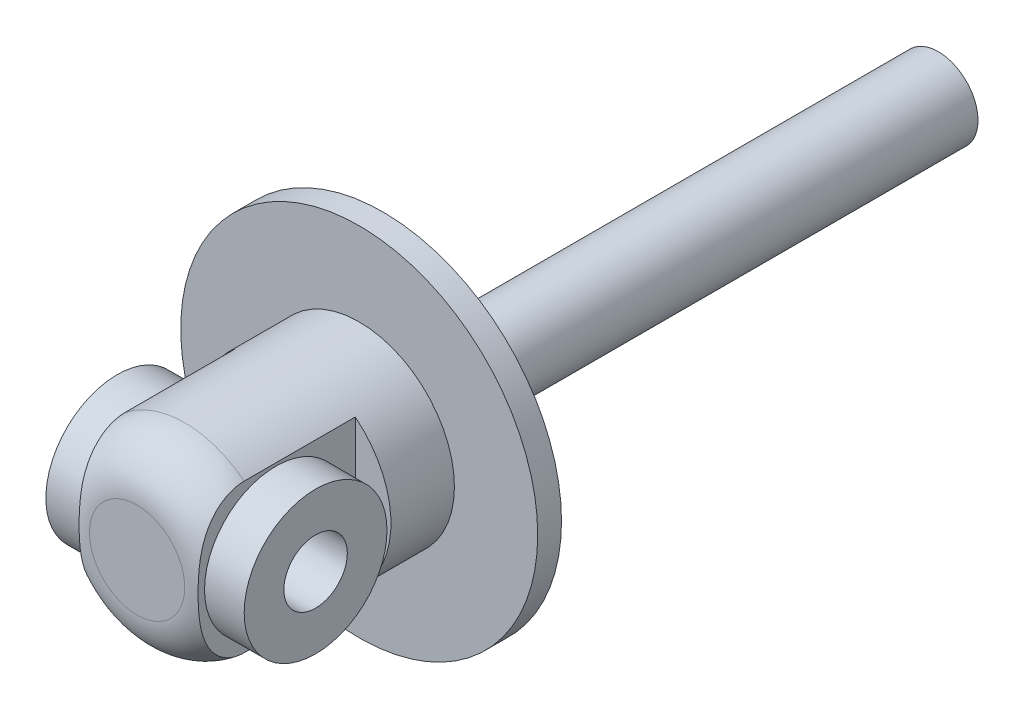
ISO-10303-21;
HEADER;
FILE_DESCRIPTION(('STEP AP214'),'2;1');
FILE_NAME('part.step','',(''),(''),'','','');
FILE_SCHEMA(('AUTOMOTIVE_DESIGN { 1 0 10303 214 1 1 1 1 }'));
ENDSEC;
DATA;
#1=APPLICATION_CONTEXT('core data for automotive mechanical design processes');
#2=APPLICATION_PROTOCOL_DEFINITION('international standard','automotive_design',2000,#1);
#3=PRODUCT_CONTEXT('',#1,'mechanical');
#4=PRODUCT('Part','Part','',(#3));
#5=PRODUCT_RELATED_PRODUCT_CATEGORY('part','',(#4));
#6=PRODUCT_DEFINITION_FORMATION('','',#4);
#7=PRODUCT_DEFINITION_CONTEXT('part definition',#1,'design');
#8=PRODUCT_DEFINITION('design','',#6,#7);
#9=PRODUCT_DEFINITION_SHAPE('','',#8);
#10=(LENGTH_UNIT() NAMED_UNIT(*) SI_UNIT(.MILLI.,.METRE.));
#11=(NAMED_UNIT(*) PLANE_ANGLE_UNIT() SI_UNIT($,.RADIAN.));
#12=(NAMED_UNIT(*) SI_UNIT($,.STERADIAN.) SOLID_ANGLE_UNIT());
#13=UNCERTAINTY_MEASURE_WITH_UNIT(LENGTH_MEASURE(1.E-05),#10,'distance_accuracy_value','');
#14=(GEOMETRIC_REPRESENTATION_CONTEXT(3) GLOBAL_UNCERTAINTY_ASSIGNED_CONTEXT((#13)) GLOBAL_UNIT_ASSIGNED_CONTEXT((#10,
#11,#12)) REPRESENTATION_CONTEXT('',''));
#15=CARTESIAN_POINT('',(0.,0.,0.));
#16=DIRECTION('',(0.,0.,1.));
#17=DIRECTION('',(1.,0.,0.));
#18=AXIS2_PLACEMENT_3D('',#15,#16,#17);
#19=CARTESIAN_POINT('',(0.,0.,70.0000000000001));
#20=DIRECTION('',(0.,0.,-1.));
#21=DIRECTION('',(-1.00000000000001,0.,0.));
#22=AXIS2_PLACEMENT_3D('',#19,#20,#21);
#23=CYLINDRICAL_SURFACE('',#22,5.);
#24=CARTESIAN_POINT('',(0.,0.,70.0000000000001));
#25=DIRECTION('',(0.,0.,1.));
#26=DIRECTION('',(1.00000000000001,0.,0.));
#27=AXIS2_PLACEMENT_3D('',#24,#25,#26);
#28=CIRCLE('',#27,5.);
#29=CARTESIAN_POINT('',(5.00000000000004,0.,70.0000000000001));
#30=VERTEX_POINT('',#29);
#31=EDGE_CURVE('E128',#30,#30,#28,.T.);
#32=ORIENTED_EDGE('',*,*,#31,.F.);
#33=EDGE_LOOP('',(#32));
#34=FACE_BOUND('',#33,.T.);
#35=CARTESIAN_POINT('',(0.,0.,0.));
#36=DIRECTION('',(0.,0.,1.));
#37=DIRECTION('',(1.00000000000001,0.,0.));
#38=AXIS2_PLACEMENT_3D('',#35,#36,#37);
#39=CIRCLE('',#38,5.);
#40=CARTESIAN_POINT('',(5.00000000000004,0.,0.));
#41=VERTEX_POINT('',#40);
#42=EDGE_CURVE('E135',#41,#41,#39,.T.);
#43=ORIENTED_EDGE('',*,*,#42,.T.);
#44=EDGE_LOOP('',(#43));
#45=FACE_BOUND('',#44,.T.);
#46=ADVANCED_FACE('F44',(#34,#45),#23,.T.);
#47=CARTESIAN_POINT('',(0.,0.,0.));
#48=DIRECTION('',(0.,0.,1.));
#49=DIRECTION('',(1.00000000000001,0.,0.));
#50=AXIS2_PLACEMENT_3D('',#47,#48,#49);
#51=PLANE('',#50);
#52=ORIENTED_EDGE('',*,*,#42,.F.);
#53=EDGE_LOOP('',(#52));
#54=FACE_BOUND('',#53,.T.);
#55=ADVANCED_FACE('F187',(#54),#51,.F.);
#56=CARTESIAN_POINT('',(0.,0.,73.));
#57=DIRECTION('',(0.,0.,-1.));
#58=DIRECTION('',(-1.00000000000001,0.,0.));
#59=AXIS2_PLACEMENT_3D('',#56,#57,#58);
#60=CYLINDRICAL_SURFACE('',#59,22.5);
#61=CARTESIAN_POINT('',(0.,0.,73.));
#62=DIRECTION('',(0.,0.,1.));
#63=DIRECTION('',(1.00000000000001,0.,0.));
#64=AXIS2_PLACEMENT_3D('',#61,#62,#63);
#65=CIRCLE('',#64,22.5);
#66=CARTESIAN_POINT('',(22.5000000000002,0.,73.));
#67=VERTEX_POINT('',#66);
#68=EDGE_CURVE('E131',#67,#67,#65,.T.);
#69=ORIENTED_EDGE('',*,*,#68,.F.);
#70=EDGE_LOOP('',(#69));
#71=FACE_BOUND('',#70,.T.);
#72=CARTESIAN_POINT('',(0.,0.,70.0000000000001));
#73=DIRECTION('',(0.,0.,1.));
#74=DIRECTION('',(1.00000000000001,0.,0.));
#75=AXIS2_PLACEMENT_3D('',#72,#73,#74);
#76=CIRCLE('',#75,22.5);
#77=CARTESIAN_POINT('',(22.5000000000002,0.,70.0000000000001));
#78=VERTEX_POINT('',#77);
#79=EDGE_CURVE('E125',#78,#78,#76,.T.);
#80=ORIENTED_EDGE('',*,*,#79,.T.);
#81=EDGE_LOOP('',(#80));
#82=FACE_BOUND('',#81,.T.);
#83=ADVANCED_FACE('F176',(#71,#82),#60,.T.);
#84=CARTESIAN_POINT('',(0.,0.,73.));
#85=DIRECTION('',(0.,0.,1.));
#86=DIRECTION('',(1.00000000000001,0.,0.));
#87=AXIS2_PLACEMENT_3D('',#84,#85,#86);
#88=PLANE('',#87);
#89=CARTESIAN_POINT('',(0.,0.,73.));
#90=DIRECTION('',(0.,0.,1.));
#91=DIRECTION('',(1.00000000000001,0.,0.));
#92=AXIS2_PLACEMENT_3D('',#89,#90,#91);
#93=CIRCLE('',#92,12.);
#94=CARTESIAN_POINT('',(12.0000000000001,0.,73.));
#95=VERTEX_POINT('',#94);
#96=EDGE_CURVE('E121',#95,#95,#93,.T.);
#97=ORIENTED_EDGE('',*,*,#96,.F.);
#98=EDGE_LOOP('',(#97));
#99=FACE_BOUND('',#98,.T.);
#100=ORIENTED_EDGE('',*,*,#68,.T.);
#101=EDGE_LOOP('',(#100));
#102=FACE_BOUND('',#101,.T.);
#103=ADVANCED_FACE('F179',(#99,#102),#88,.T.);
#104=CARTESIAN_POINT('',(0.,0.,70.0000000000001));
#105=DIRECTION('',(0.,0.,1.));
#106=DIRECTION('',(1.00000000000001,0.,0.));
#107=AXIS2_PLACEMENT_3D('',#104,#105,#106);
#108=PLANE('',#107);
#109=ORIENTED_EDGE('',*,*,#31,.T.);
#110=EDGE_LOOP('',(#109));
#111=FACE_BOUND('',#110,.T.);
#112=ORIENTED_EDGE('',*,*,#79,.F.);
#113=EDGE_LOOP('',(#112));
#114=FACE_BOUND('',#113,.T.);
#115=ADVANCED_FACE('F178',(#111,#114),#108,.F.);
#116=CARTESIAN_POINT('',(0.,0.,101.));
#117=DIRECTION('',(0.,0.,-1.));
#118=DIRECTION('',(-1.00000000000001,0.,0.));
#119=AXIS2_PLACEMENT_3D('',#116,#117,#118);
#120=CYLINDRICAL_SURFACE('',#119,12.);
#121=CARTESIAN_POINT('',(0.,0.,95.));
#122=DIRECTION('',(0.,0.,1.));
#123=DIRECTION('',(1.00000000000001,0.,0.));
#124=AXIS2_PLACEMENT_3D('',#121,#122,#123);
#125=CIRCLE('',#124,12.);
#126=CARTESIAN_POINT('',(-7.50000000000006,9.36749699759876,95.));
#127=VERTEX_POINT('',#126);
#128=CARTESIAN_POINT('',(7.50000000000045,9.36749699759853,95.));
#129=VERTEX_POINT('',#128);
#130=EDGE_CURVE('E146',#127,#129,#125,.F.);
#131=ORIENTED_EDGE('',*,*,#130,.T.);
#132=DIRECTION('',(0.,0.,-1.));
#133=VECTOR('',#132,1.);
#134=CARTESIAN_POINT('',(7.50000000000045,9.36749699759853,101.));
#135=LINE('',#134,#133);
#136=CARTESIAN_POINT('',(7.50000000000045,9.36749699759853,81.));
#137=VERTEX_POINT('',#136);
#138=EDGE_CURVE('E64',#129,#137,#135,.T.);
#139=ORIENTED_EDGE('',*,*,#138,.T.);
#140=CARTESIAN_POINT('',(0.,0.,81.));
#141=DIRECTION('',(0.,0.,-1.));
#142=DIRECTION('',(-1.00000000000001,0.,0.));
#143=AXIS2_PLACEMENT_3D('',#140,#141,#142);
#144=CIRCLE('',#143,12.);
#145=CARTESIAN_POINT('',(7.50000000000006,-9.36749699759742,81.));
#146=VERTEX_POINT('',#145);
#147=EDGE_CURVE('E100',#137,#146,#144,.T.);
#148=ORIENTED_EDGE('',*,*,#147,.T.);
#149=DIRECTION('',(0.,0.,-1.));
#150=VECTOR('',#149,1.);
#151=CARTESIAN_POINT('',(7.50000000000006,-9.36749699759742,101.));
#152=LINE('',#151,#150);
#153=CARTESIAN_POINT('',(7.50000000000006,-9.36749699759765,95.));
#154=VERTEX_POINT('',#153);
#155=EDGE_CURVE('E111',#146,#154,#152,.F.);
#156=ORIENTED_EDGE('',*,*,#155,.T.);
#157=CARTESIAN_POINT('',(-7.49999999999984,-9.36749699759742,95.));
#158=VERTEX_POINT('',#157);
#159=EDGE_CURVE('E115',#154,#158,#125,.F.);
#160=ORIENTED_EDGE('',*,*,#159,.T.);
#161=DIRECTION('',(0.,0.,-1.));
#162=VECTOR('',#161,1.);
#163=CARTESIAN_POINT('',(-7.49999999999984,-9.36749699759742,101.));
#164=LINE('',#163,#162);
#165=CARTESIAN_POINT('',(-7.49999999999984,-9.36749699759742,81.));
#166=VERTEX_POINT('',#165);
#167=EDGE_CURVE('E72',#158,#166,#164,.T.);
#168=ORIENTED_EDGE('',*,*,#167,.T.);
#169=CARTESIAN_POINT('',(0.,0.,81.));
#170=DIRECTION('',(0.,0.,-1.));
#171=DIRECTION('',(-1.00000000000001,0.,0.));
#172=AXIS2_PLACEMENT_3D('',#169,#170,#171);
#173=CIRCLE('',#172,12.);
#174=CARTESIAN_POINT('',(-7.49999999999979,9.36749699759787,81.));
#175=VERTEX_POINT('',#174);
#176=EDGE_CURVE('E93',#166,#175,#173,.T.);
#177=ORIENTED_EDGE('',*,*,#176,.T.);
#178=DIRECTION('',(0.,0.,-1.));
#179=VECTOR('',#178,1.);
#180=CARTESIAN_POINT('',(-7.49999999999979,9.36749699759787,101.));
#181=LINE('',#180,#179);
#182=EDGE_CURVE('E101',#175,#127,#181,.F.);
#183=ORIENTED_EDGE('',*,*,#182,.T.);
#184=EDGE_LOOP('',(#131,#139,#148,#156,#160,#168,#177,#183));
#185=FACE_BOUND('',#184,.T.);
#186=ORIENTED_EDGE('',*,*,#96,.T.);
#187=EDGE_LOOP('',(#186));
#188=FACE_BOUND('',#187,.T.);
#189=ADVANCED_FACE('F107',(#185,#188),#120,.T.);
#190=CARTESIAN_POINT('',(0.,0.,101.));
#191=DIRECTION('',(0.,0.,1.));
#192=DIRECTION('',(1.00000000000001,0.,0.));
#193=AXIS2_PLACEMENT_3D('',#190,#191,#192);
#194=PLANE('',#193);
#195=CARTESIAN_POINT('',(0.,0.,101.));
#196=DIRECTION('',(0.,0.,1.));
#197=DIRECTION('',(1.00000000000001,0.,0.));
#198=AXIS2_PLACEMENT_3D('',#195,#196,#197);
#199=CIRCLE('',#198,6.);
#200=CARTESIAN_POINT('',(6.00000000000005,0.,101.));
#201=VERTEX_POINT('',#200);
#202=EDGE_CURVE('E129',#201,#201,#199,.T.);
#203=ORIENTED_EDGE('',*,*,#202,.T.);
#204=EDGE_LOOP('',(#203));
#205=FACE_BOUND('',#204,.T.);
#206=ADVANCED_FACE('F168',(#205),#194,.T.);
#207=CARTESIAN_POINT('',(0.,0.,95.));
#208=DIRECTION('',(0.,0.,1.));
#209=DIRECTION('',(1.00000000000001,0.,0.));
#210=AXIS2_PLACEMENT_3D('',#207,#208,#209);
#211=TOROIDAL_SURFACE('',#210,6.,6.);
#212=CARTESIAN_POINT('',(7.50000000000062,4.44089209850063E-13,100.809475019311));
#213=CARTESIAN_POINT('',(7.50000000000062,-0.184521628241983,100.809475295815));
#214=CARTESIAN_POINT('',(7.50000000000054,-0.369043480286763,100.8077270323));
#215=CARTESIAN_POINT('',(7.50000000000048,-0.737999394291874,100.800613062887));
#216=CARTESIAN_POINT('',(7.5000000000005,-0.922433463433983,100.795247736706));
#217=CARTESIAN_POINT('',(7.50000000000051,-1.29122559425424,100.780538513706));
#218=CARTESIAN_POINT('',(7.50000000000051,-1.47558358999883,100.771192921557));
#219=CARTESIAN_POINT('',(7.50000000000051,-1.84401846668282,100.747950764088));
#220=CARTESIAN_POINT('',(7.50000000000051,-2.02809534398308,100.734054140347));
#221=CARTESIAN_POINT('',(7.5000000000005,-2.39498843631808,100.701027325669));
#222=CARTESIAN_POINT('',(7.50000000000049,-2.57780665418299,100.681920129909));
#223=CARTESIAN_POINT('',(7.50000000000052,-2.94269408038059,100.637568221756));
#224=CARTESIAN_POINT('',(7.50000000000057,-3.12476323156481,100.612323049597));
#225=CARTESIAN_POINT('',(7.50000000000037,-3.66916325054772,100.525936026226));
#226=CARTESIAN_POINT('',(7.49999999999976,-4.02997739530089,100.454119622395));
#227=CARTESIAN_POINT('',(7.50000000000006,-4.57935988961699,100.315114172541));
#228=CARTESIAN_POINT('',(7.5000000000004,-4.77122256452957,100.26083488487));
#229=CARTESIAN_POINT('',(7.50000000000062,-5.15109529504932,100.140241103609));
#230=CARTESIAN_POINT('',(7.5000000000005,-5.33910680786532,100.073931259407));
#231=CARTESIAN_POINT('',(7.50000000000051,-5.70992505463458,99.9281486989916));
#232=CARTESIAN_POINT('',(7.50000000000064,-5.89273327912073,99.8486797977085));
#233=CARTESIAN_POINT('',(7.50000000000037,-6.25155879665888,99.6756224712838));
#234=CARTESIAN_POINT('',(7.49999999999997,-6.42757723883478,99.5820364486501));
#235=CARTESIAN_POINT('',(7.50000000000004,-6.74413785403008,99.3958384208507));
#236=CARTESIAN_POINT('',(7.50000000000038,-6.88593021366751,99.3053527427413));
#237=CARTESIAN_POINT('',(7.50000000000063,-7.1620525412201,99.1136422044665));
#238=CARTESIAN_POINT('',(7.50000000000054,-7.29638393401307,99.0124194056701));
#239=CARTESIAN_POINT('',(7.50000000000047,-7.55627452274025,98.7991822855036));
#240=CARTESIAN_POINT('',(7.50000000000048,-7.68183150549878,98.6871652583254));
#241=CARTESIAN_POINT('',(7.50000000000053,-7.92270374400301,98.4525813942248));
#242=CARTESIAN_POINT('',(7.50000000000057,-8.03801892249749,98.330014477741));
#243=CARTESIAN_POINT('',(7.50000000000056,-8.25792234562919,98.0736714823963));
#244=CARTESIAN_POINT('',(7.50000000000051,-8.36240569865879,97.9398051473306));
#245=CARTESIAN_POINT('',(7.5000000000005,-8.55796576900225,97.6626169206151));
#246=CARTESIAN_POINT('',(7.50000000000054,-8.64904436046024,97.519296354844));
#247=CARTESIAN_POINT('',(7.50000000000047,-8.81636481076577,97.2243409104847));
#248=CARTESIAN_POINT('',(7.50000000000035,-8.89261579636745,97.0727112205187));
#249=CARTESIAN_POINT('',(7.50000000000066,-9.02909243430902,96.762409505274));
#250=CARTESIAN_POINT('',(7.5000000000011,-9.08932115899356,96.6037388369551));
#251=CARTESIAN_POINT('',(7.50000000000103,-9.18495143348953,96.305224545915));
#252=CARTESIAN_POINT('',(7.50000000000065,-9.2227240579568,96.166136129491));
#253=CARTESIAN_POINT('',(7.50000000000036,-9.28547940350134,95.8851087613884));
#254=CARTESIAN_POINT('',(7.50000000000046,-9.31046370365598,95.7431701638949));
#255=CARTESIAN_POINT('',(7.50000000000056,-9.34730641698973,95.4576599589477));
#256=CARTESIAN_POINT('',(7.50000000000056,-9.35917031033255,95.3140890586128));
#257=CARTESIAN_POINT('',(7.50000000000045,-9.36963164548822,95.0264648581988));
#258=CARTESIAN_POINT('',(7.50000000000033,-9.36822954903892,94.8824115750841));
#259=CARTESIAN_POINT('',(7.50000000000034,-9.35280339576843,94.6061914815274));
#260=CARTESIAN_POINT('',(7.50000000000045,-9.33976569953756,94.4739684759152));
#261=CARTESIAN_POINT('',(7.50000000000056,-9.3025636387868,94.2110534946454));
#262=CARTESIAN_POINT('',(7.50000000000056,-9.27839574533018,94.0803620180606));
#263=CARTESIAN_POINT('',(7.50000000000045,-9.21922065645544,93.821541060961));
#264=CARTESIAN_POINT('',(7.50000000000034,-9.1842198149553,93.6934101253724));
#265=CARTESIAN_POINT('',(7.50000000000067,-9.10374552536095,93.440434044251));
#266=CARTESIAN_POINT('',(7.50000000000111,-9.0582681536653,93.3155901493275));
#267=CARTESIAN_POINT('',(7.50000000000112,-8.9569956452045,93.0692031015504));
#268=CARTESIAN_POINT('',(7.50000000000069,-8.90113499399677,92.9476868658849));
#269=CARTESIAN_POINT('',(7.50000000000032,-8.77987692751851,92.7094920695398));
#270=CARTESIAN_POINT('',(7.50000000000038,-8.7144761052689,92.5928152563099));
#271=CARTESIAN_POINT('',(7.50000000000076,-8.50489875856283,92.2509911073172));
#272=CARTESIAN_POINT('',(7.5000000000013,-8.34729299116807,92.0339195251878));
#273=CARTESIAN_POINT('',(7.50000000000138,-7.98870608163024,91.6093374279542));
#274=CARTESIAN_POINT('',(7.50000000000085,-7.78529755950515,91.4039002281567));
#275=CARTESIAN_POINT('',(7.50000000000016,-7.3510904064671,91.0246758733924));
#276=CARTESIAN_POINT('',(7.50000000000001,-7.12029612399653,90.8508837047535));
#277=CARTESIAN_POINT('',(7.5000000000002,-6.69864287979097,90.5744409595824));
#278=CARTESIAN_POINT('',(7.50000000000043,-6.51223410047249,90.4648689537029));
#279=CARTESIAN_POINT('',(7.50000000000058,-6.13034538679057,90.2626904112624));
#280=CARTESIAN_POINT('',(7.50000000000051,-5.93486117014332,90.1700919878545));
#281=CARTESIAN_POINT('',(7.5000000000005,-5.53658641063431,90.0006313082271));
#282=CARTESIAN_POINT('',(7.50000000000058,-5.33377659321351,89.923814755595));
#283=CARTESIAN_POINT('',(7.50000000000043,-4.92331428460776,89.7848753626251));
#284=CARTESIAN_POINT('',(7.50000000000021,-4.71566315546439,89.7227484430635));
#285=CARTESIAN_POINT('',(7.49999999999991,-4.02250667384599,89.5386673542947));
#286=CARTESIAN_POINT('',(7.50000000000039,-3.52942656369846,89.4449803111872));
#287=CARTESIAN_POINT('',(7.50000000000056,-2.78498720051432,89.3412352530645));
#288=CARTESIAN_POINT('',(7.50000000000052,-2.53568557770015,89.3127705467373));
#289=CARTESIAN_POINT('',(7.50000000000049,-2.03612434937405,89.2658269581613));
#290=CARTESIAN_POINT('',(7.5000000000005,-1.78586486368108,89.247346865565));
#291=CARTESIAN_POINT('',(7.50000000000051,-1.28363112408621,89.2184283009415));
#292=CARTESIAN_POINT('',(7.50000000000051,-1.03165466176062,89.2080315907861));
#293=CARTESIAN_POINT('',(7.5000000000005,-0.527501194688431,89.1941849220445));
#294=CARTESIAN_POINT('',(7.50000000000048,-0.275324180848684,89.1907352988047));
#295=CARTESIAN_POINT('',(7.50000000000053,0.228731345603153,89.1903333462323));
#296=CARTESIAN_POINT('',(7.5000000000006,0.480609853630324,89.1933732324941));
#297=CARTESIAN_POINT('',(7.5000000000004,0.98417358149436,89.2063332691716));
#298=CARTESIAN_POINT('',(7.50000000000013,1.2358588166088,89.2162528039697));
#299=CARTESIAN_POINT('',(7.5000000000001,1.76278825668939,89.2454935008678));
#300=CARTESIAN_POINT('',(7.5000000000004,2.03798990109177,89.2656211327379));
#301=CARTESIAN_POINT('',(7.50000000000061,2.58731345976849,89.3180418431019));
#302=CARTESIAN_POINT('',(7.50000000000051,2.86143522597458,89.3503365349837));
#303=CARTESIAN_POINT('',(7.5000000000005,3.40623279358456,89.4300545548585));
#304=CARTESIAN_POINT('',(7.50000000000058,3.67691867401895,89.4774071358836));
#305=CARTESIAN_POINT('',(7.50000000000043,4.21439476079985,89.5907053400648));
#306=CARTESIAN_POINT('',(7.50000000000019,4.48118620316514,89.6566449229109));
#307=CARTESIAN_POINT('',(7.50000000000025,4.94217748017491,89.7911834026755));
#308=CARTESIAN_POINT('',(7.50000000000043,5.13778160857854,89.8549558474622));
#309=CARTESIAN_POINT('',(7.50000000000058,5.52399422741797,89.9961265709527));
#310=CARTESIAN_POINT('',(7.50000000000055,5.71460418712206,90.0735207892674));
#311=CARTESIAN_POINT('',(7.50000000000046,6.08921987221964,90.2430793617632));
#312=CARTESIAN_POINT('',(7.5000000000004,6.27322442084505,90.3352463319148));
#313=CARTESIAN_POINT('',(7.50000000000061,6.63256976145566,90.5351759469559));
#314=CARTESIAN_POINT('',(7.50000000000088,6.80791280693755,90.6429345063483));
#315=CARTESIAN_POINT('',(7.50000000000081,7.10989658300806,90.8487615005738));
#316=CARTESIAN_POINT('',(7.50000000000059,7.2387010399772,90.9436617626476));
#317=CARTESIAN_POINT('',(7.50000000000042,7.48856622066256,91.143229826347));
#318=CARTESIAN_POINT('',(7.50000000000047,7.6096260215225,91.2478987883743));
#319=CARTESIAN_POINT('',(7.50000000000054,7.84271387792506,91.46680459494));
#320=CARTESIAN_POINT('',(7.50000000000057,7.95474473789622,91.5810384459296));
#321=CARTESIAN_POINT('',(7.50000000000044,8.16854933672522,91.8187268203139));
#322=CARTESIAN_POINT('',(7.50000000000028,8.27032449995024,91.9421800591117));
#323=CARTESIAN_POINT('',(7.50000000000029,8.46313596223117,92.1987356397018));
#324=CARTESIAN_POINT('',(7.50000000000045,8.55408255407207,92.3319055781878));
#325=CARTESIAN_POINT('',(7.50000000000055,8.72304401015898,92.6061418402463));
#326=CARTESIAN_POINT('',(7.50000000000049,8.80106500403673,92.7472043782544));
#327=CARTESIAN_POINT('',(7.50000000000052,8.94309470867616,93.0362068877476));
#328=CARTESIAN_POINT('',(7.50000000000063,9.00710515749563,93.1841460034052));
#329=CARTESIAN_POINT('',(7.50000000000038,9.12014361193672,93.4856380297526));
#330=CARTESIAN_POINT('',(7.50000000000003,9.16917373274803,93.6391901444678));
#331=CARTESIAN_POINT('',(7.50000000000009,9.24643392787079,93.9313639562728));
#332=CARTESIAN_POINT('',(7.50000000000041,9.27647685632851,94.0695088202569));
#333=CARTESIAN_POINT('',(7.5000000000006,9.32406143536844,94.3479315795215));
#334=CARTESIAN_POINT('',(7.50000000000049,9.34160421520888,94.4882092809528));
#335=CARTESIAN_POINT('',(7.50000000000052,9.36396002322638,94.7697196095892));
#336=CARTESIAN_POINT('',(7.50000000000068,9.36877802252993,94.9109518422675));
#337=CARTESIAN_POINT('',(7.50000000000033,9.36563613906227,95.1932734390958));
#338=CARTESIAN_POINT('',(7.49999999999982,9.35767657732169,95.3343628067461));
#339=CARTESIAN_POINT('',(7.49999999999986,9.32998563551048,95.6064011749063));
#340=CARTESIAN_POINT('',(7.50000000000034,9.31102660205244,95.7374295539783));
#341=CARTESIAN_POINT('',(7.50000000000067,9.26218788836574,95.9974780227225));
#342=CARTESIAN_POINT('',(7.50000000000053,9.23230470755146,96.1264974548056));
#343=CARTESIAN_POINT('',(7.50000000000048,9.16196479385483,96.3815508516767));
#344=CARTESIAN_POINT('',(7.50000000000058,9.12151307666038,96.5075862018083));
#345=CARTESIAN_POINT('',(7.50000000000043,9.0304488803736,96.7559772755244));
#346=CARTESIAN_POINT('',(7.50000000000018,8.97983258590805,96.8783315975105));
#347=CARTESIAN_POINT('',(7.50000000000017,8.86806175742506,97.1205569584555));
#348=CARTESIAN_POINT('',(7.50000000000041,8.80674877020264,97.2403549182386));
#349=CARTESIAN_POINT('',(7.5000000000006,8.6748018744195,97.4747211723636));
#350=CARTESIAN_POINT('',(7.50000000000053,8.60416462323278,97.589287571342));
#351=CARTESIAN_POINT('',(7.50000000000045,8.37928997825757,97.9242270275787));
#352=CARTESIAN_POINT('',(7.50000000000053,8.2120140726486,98.1360021075501));
#353=CARTESIAN_POINT('',(7.5000000000006,7.83294273917814,98.5504485361802));
#354=CARTESIAN_POINT('',(7.50000000000058,7.61853228584692,98.7507010772534));
#355=CARTESIAN_POINT('',(7.50000000000043,7.16337882817296,99.1185076671658));
#356=CARTESIAN_POINT('',(7.50000000000031,6.92262753033006,99.2860513710233));
#357=CARTESIAN_POINT('',(7.50000000000036,6.4788664395956,99.5545024709802));
#358=CARTESIAN_POINT('',(7.50000000000047,6.27970729507814,99.661901325276));
#359=CARTESIAN_POINT('',(7.50000000000054,5.87254463104013,99.8585592195866));
#360=CARTESIAN_POINT('',(7.50000000000049,5.66453691936402,99.9478095430474));
#361=CARTESIAN_POINT('',(7.50000000000052,5.24180758530229,100.10962149737));
#362=CARTESIAN_POINT('',(7.5000000000006,5.02707553901322,100.182155596004));
#363=CARTESIAN_POINT('',(7.50000000000041,4.59305326757343,100.312100136976));
#364=CARTESIAN_POINT('',(7.50000000000013,4.37376133898645,100.369504813784));
#365=CARTESIAN_POINT('',(7.49999999999996,3.81417726059932,100.498188674937));
#366=CARTESIAN_POINT('',(7.50000000000036,3.47183296905165,100.560495171619));
#367=CARTESIAN_POINT('',(7.50000000000065,2.78359200614871,100.660901968432));
#368=CARTESIAN_POINT('',(7.50000000000053,2.43769315620313,100.698986397292));
#369=CARTESIAN_POINT('',(7.50000000000049,1.91723181279203,100.742556330873));
#370=CARTESIAN_POINT('',(7.5000000000005,1.74318957751343,100.754829112801));
#371=CARTESIAN_POINT('',(7.50000000000051,1.39487161182989,100.775398699578));
#372=CARTESIAN_POINT('',(7.50000000000052,1.22059588725662,100.783695601939));
#373=CARTESIAN_POINT('',(7.5000000000005,0.871965392986331,100.796777523185));
#374=CARTESIAN_POINT('',(7.50000000000048,0.697610658492491,100.801563512939));
#375=CARTESIAN_POINT('',(7.50000000000054,0.348837350644274,100.807912185599));
#376=CARTESIAN_POINT('',(7.50000000000061,0.17441877530545,100.809474757946));
#377=CARTESIAN_POINT('',(7.50000000000062,4.44089209850063E-13,100.809475019311));
#378=B_SPLINE_CURVE_WITH_KNOTS('',3,(#212,#213,#214,#215,#216,#217,#218,#219,#220,#221,#222,
#223,#224,#225,#226,#227,#228,#229,#230,#231,#232,#233,#234,#235,#236,#237,#238,#239,#240,#241,
#242,#243,#244,#245,#246,#247,#248,#249,#250,#251,#252,#253,#254,#255,#256,#257,#258,#259,#260,
#261,#262,#263,#264,#265,#266,#267,#268,#269,#270,#271,#272,#273,#274,#275,#276,#277,#278,#279,
#280,#281,#282,#283,#284,#285,#286,#287,#288,#289,#290,#291,#292,#293,#294,#295,#296,#297,#298,
#299,#300,#301,#302,#303,#304,#305,#306,#307,#308,#309,#310,#311,#312,#313,#314,#315,#316,#317,
#318,#319,#320,#321,#322,#323,#324,#325,#326,#327,#328,#329,#330,#331,#332,#333,#334,#335,#336,
#337,#338,#339,#340,#341,#342,#343,#344,#345,#346,#347,#348,#349,#350,#351,#352,#353,#354,#355,
#356,#357,#358,#359,#360,#361,#362,#363,#364,#365,#366,#367,#368,#369,#370,#371,#372,#373,#374,
#375,#376,#377),.UNSPECIFIED.,.T.,.F.,(4,2,2,2,2,2,2,2,2,2,2,2,2,2,2,2,2,2,2,2,2,2,2,2,2,2,2,2,
2,2,2,2,2,2,2,2,2,2,2,2,2,2,2,2,2,2,2,2,2,2,2,2,2,2,2,2,2,2,2,2,2,2,2,2,2,2,2,2,2,2,2,2,2,2,2,2,
2,2,2,2,2,2,4),(0.,0.553556541747934,1.10705498067116,1.66078940935181,2.21453094651218,
2.76586720349688,3.31724477121608,4.41912680182797,5.01698525599333,5.61461314908684,
6.21206808675684,6.80942146164147,7.31357153503251,7.8176249936131,8.3218051344766,
8.82598907791473,9.33467160980067,9.84328295415653,10.3515802378954,10.8597799828436,
11.2915880375669,11.7233427606026,12.1549170790764,12.5864763761707,12.9845986570772,
13.3828472534998,13.7808627038907,14.1790274594524,14.5797954507884,14.9807069160891,
15.7821103743009,16.6461503316802,17.510053275781,18.1578732554309,18.8060020817712,
19.4559821948785,20.1057815998323,21.6069748462102,22.3596793389018,23.1122925673172,
23.8687687149105,24.6252813779035,25.3808870860733,26.1364251884586,26.9640249034872,
27.7917343993227,28.6156111127978,29.4392203950448,30.0559954213971,30.6725869093734,
31.2892877047371,31.9058271963488,32.3853559200311,32.86494167852,33.3443778968312,
33.8237474363806,34.3068464150839,34.7897156366598,35.2725249226039,35.75526600539,
36.1788379642457,36.6023716529335,37.0257398573381,37.449097424968,37.8458122806126,
38.2426543730436,38.639308470492,39.0361117351613,39.4393886143657,39.842810457648,
40.6491243408264,41.5260051520053,42.4031628508025,43.0810551134685,43.7592721958239,
44.4385984678255,45.1181832448298,46.1608437011135,47.204186648476,47.7275747628329,
48.2509500399326,48.7741805338569,49.297428973584),.UNSPECIFIED.);
#379=EDGE_CURVE('E98',#129,#154,#378,.T.);
#380=ORIENTED_EDGE('',*,*,#379,.F.);
#381=ORIENTED_EDGE('',*,*,#130,.F.);
#382=CARTESIAN_POINT('',(-7.49999999999951,6.66133814775094E-13,100.809475019311));
#383=CARTESIAN_POINT('',(-7.49999999999951,0.184521628243078,100.809475295815));
#384=CARTESIAN_POINT('',(-7.49999999999943,0.369043480287843,100.8077270323));
#385=CARTESIAN_POINT('',(-7.49999999999937,0.73799939429292,100.800613062888));
#386=CARTESIAN_POINT('',(-7.49999999999939,0.922433463435012,100.795247736707));
#387=CARTESIAN_POINT('',(-7.4999999999994,1.29122559425522,100.780538513706));
#388=CARTESIAN_POINT('',(-7.4999999999994,1.47558358999978,100.771192921557));
#389=CARTESIAN_POINT('',(-7.49999999999939,1.84401846668372,100.747950764088));
#390=CARTESIAN_POINT('',(-7.49999999999939,2.02809534398395,100.734054140347));
#391=CARTESIAN_POINT('',(-7.4999999999994,2.3949884363189,100.701027325669));
#392=CARTESIAN_POINT('',(-7.49999999999941,2.57780665418378,100.681920129909));
#393=CARTESIAN_POINT('',(-7.49999999999938,2.94269408038132,100.637568221756));
#394=CARTESIAN_POINT('',(-7.49999999999935,3.12476323156552,100.612323049597));
#395=CARTESIAN_POINT('',(-7.49999999999949,3.66916325054831,100.525936026226));
#396=CARTESIAN_POINT('',(-7.49999999999992,4.02997739530134,100.454119622395));
#397=CARTESIAN_POINT('',(-7.49999999999971,4.57935988961743,100.315114172541));
#398=CARTESIAN_POINT('',(-7.49999999999947,4.77122256453004,100.26083488487));
#399=CARTESIAN_POINT('',(-7.49999999999932,5.15109529504977,100.14024110361));
#400=CARTESIAN_POINT('',(-7.49999999999941,5.33910680786571,100.073931259408));
#401=CARTESIAN_POINT('',(-7.49999999999938,5.70992505463495,99.9281486989921));
#402=CARTESIAN_POINT('',(-7.49999999999927,5.89273327912115,99.8486797977092));
#403=CARTESIAN_POINT('',(-7.49999999999952,6.2515587966591,99.6756224712842));
#404=CARTESIAN_POINT('',(-7.49999999999988,6.42757723883475,99.5820364486501));
#405=CARTESIAN_POINT('',(-7.49999999999981,6.74413785403018,99.3958384208507));
#406=CARTESIAN_POINT('',(-7.4999999999995,6.88593021366792,99.3053527427417));
#407=CARTESIAN_POINT('',(-7.49999999999929,7.1620525412208,99.113642204467));
#408=CARTESIAN_POINT('',(-7.49999999999939,7.29638393401375,99.0124194056705));
#409=CARTESIAN_POINT('',(-7.4999999999994,7.55627452274098,98.7991822855039));
#410=CARTESIAN_POINT('',(-7.4999999999993,7.68183150549959,98.6871652583257));
#411=CARTESIAN_POINT('',(-7.49999999999949,7.92270374400387,98.4525813942249));
#412=CARTESIAN_POINT('',(-7.49999999999979,8.03801892249834,98.3300144777411));
#413=CARTESIAN_POINT('',(-7.49999999999979,8.25792234563008,98.0736714823963));
#414=CARTESIAN_POINT('',(-7.49999999999949,8.36240569865973,97.9398051473307));
#415=CARTESIAN_POINT('',(-7.4999999999993,8.55796576900324,97.6626169206152));
#416=CARTESIAN_POINT('',(-7.49999999999942,8.64904436046123,97.519296354844));
#417=CARTESIAN_POINT('',(-7.49999999999937,8.81636481076671,97.2243409104847));
#418=CARTESIAN_POINT('',(-7.49999999999921,8.89261579636835,97.0727112205186));
#419=CARTESIAN_POINT('',(-7.49999999999958,9.02909243431002,96.762409505274));
#420=CARTESIAN_POINT('',(-7.50000000000011,9.08932115899469,96.6037388369551));
#421=CARTESIAN_POINT('',(-7.50000000000002,9.18495143349061,96.305224545915));
#422=CARTESIAN_POINT('',(-7.49999999999956,9.22272405795775,96.166136129491));
#423=CARTESIAN_POINT('',(-7.49999999999923,9.2854794035022,95.8851087613883));
#424=CARTESIAN_POINT('',(-7.49999999999935,9.31046370365687,95.7431701638948));
#425=CARTESIAN_POINT('',(-7.49999999999944,9.34730641699064,95.4576599589477));
#426=CARTESIAN_POINT('',(-7.49999999999942,9.35917031033344,95.3140890586127));
#427=CARTESIAN_POINT('',(-7.49999999999937,9.3696316454891,95.0264648581987));
#428=CARTESIAN_POINT('',(-7.49999999999934,9.36822954903981,94.8824115750841));
#429=CARTESIAN_POINT('',(-7.49999999999934,9.35280339576932,94.6061914815274));
#430=CARTESIAN_POINT('',(-7.49999999999937,9.33976569953845,94.4739684759152));
#431=CARTESIAN_POINT('',(-7.49999999999942,9.3025636387877,94.2110534946455));
#432=CARTESIAN_POINT('',(-7.49999999999945,9.27839574533111,94.0803620180606));
#433=CARTESIAN_POINT('',(-7.49999999999934,9.21922065645633,93.821541060961));
#434=CARTESIAN_POINT('',(-7.4999999999992,9.18421981495613,93.6934101253724));
#435=CARTESIAN_POINT('',(-7.49999999999959,9.10374552536198,93.4404340442511));
#436=CARTESIAN_POINT('',(-7.50000000000011,9.05826815366661,93.3155901493275));
#437=CARTESIAN_POINT('',(-7.50000000000012,8.95699564520585,93.0692031015504));
#438=CARTESIAN_POINT('',(-7.49999999999961,8.90113499399789,92.947686865885));
#439=CARTESIAN_POINT('',(-7.49999999999918,8.77987692751946,92.70949206954));
#440=CARTESIAN_POINT('',(-7.49999999999926,8.7144761052699,92.5928152563101));
#441=CARTESIAN_POINT('',(-7.49999999999966,8.50489875856401,92.2509911073173));
#442=CARTESIAN_POINT('',(-7.50000000000012,8.34729299116937,92.0339195251878));
#443=CARTESIAN_POINT('',(-7.5,7.98870608163153,91.6093374279541));
#444=CARTESIAN_POINT('',(-7.49999999999935,7.78529755950632,91.4039002281565));
#445=CARTESIAN_POINT('',(-7.49999999999944,7.35109040646788,91.0246758733923));
#446=CARTESIAN_POINT('',(-7.50000000000018,7.12029612399704,90.8508837047536));
#447=CARTESIAN_POINT('',(-7.50000000000007,6.69864287979145,90.5744409595824));
#448=CARTESIAN_POINT('',(-7.49999999999957,6.51223410047312,90.4648689537027));
#449=CARTESIAN_POINT('',(-7.49999999999922,6.13034538679134,90.262690411262));
#450=CARTESIAN_POINT('',(-7.49999999999938,5.93486117014407,90.1700919878542));
#451=CARTESIAN_POINT('',(-7.49999999999941,5.5365864106351,90.0006313082268));
#452=CARTESIAN_POINT('',(-7.49999999999928,5.33377659321436,89.9238147555947));
#453=CARTESIAN_POINT('',(-7.49999999999951,4.92331428460866,89.7848753626249));
#454=CARTESIAN_POINT('',(-7.49999999999986,4.71566315546527,89.7227484430635));
#455=CARTESIAN_POINT('',(-7.50000000000034,4.02250667384677,89.5386673542948));
#456=CARTESIAN_POINT('',(-7.49999999999957,3.52942656369924,89.444980311187));
#457=CARTESIAN_POINT('',(-7.49999999999931,2.78498720051505,89.3412352530642));
#458=CARTESIAN_POINT('',(-7.49999999999937,2.53568557770086,89.312770546737));
#459=CARTESIAN_POINT('',(-7.49999999999942,2.03612434937472,89.265826958161));
#460=CARTESIAN_POINT('',(-7.4999999999994,1.78586486368174,89.2473468655647));
#461=CARTESIAN_POINT('',(-7.49999999999938,1.28363112408682,89.2184283009412));
#462=CARTESIAN_POINT('',(-7.49999999999938,1.0316546617612,89.2080315907859));
#463=CARTESIAN_POINT('',(-7.49999999999941,0.527501194688963,89.1941849220442));
#464=CARTESIAN_POINT('',(-7.49999999999944,0.275324180849193,89.1907352988045));
#465=CARTESIAN_POINT('',(-7.49999999999935,-0.228731345602712,89.190333346232));
#466=CARTESIAN_POINT('',(-7.49999999999924,-0.480609853629927,89.1933732324938));
#467=CARTESIAN_POINT('',(-7.49999999999955,-0.984173581494047,89.2063332691713));
#468=CARTESIAN_POINT('',(-7.49999999999998,-1.23585881660853,89.2162528039697));
#469=CARTESIAN_POINT('',(-7.50000000000003,-1.76278825668911,89.2454935008678));
#470=CARTESIAN_POINT('',(-7.49999999999956,-2.03798990109146,89.2656211327377));
#471=CARTESIAN_POINT('',(-7.49999999999923,-2.58731345976805,89.3180418431014));
#472=CARTESIAN_POINT('',(-7.49999999999936,-2.86143522597404,89.3503365349833));
#473=CARTESIAN_POINT('',(-7.49999999999943,-3.4062327935839,89.4300545548579));
#474=CARTESIAN_POINT('',(-7.49999999999935,-3.67691867401825,89.4774071358828));
#475=CARTESIAN_POINT('',(-7.49999999999944,-4.21439476079892,89.5907053400643));
#476=CARTESIAN_POINT('',(-7.49999999999959,-4.481186203164,89.6566449229111));
#477=CARTESIAN_POINT('',(-7.49999999999954,-4.94217748017383,89.7911834026754));
#478=CARTESIAN_POINT('',(-7.49999999999943,-5.13778160857764,89.8549558474615));
#479=CARTESIAN_POINT('',(-7.49999999999936,-5.52399422741715,89.9961265709516));
#480=CARTESIAN_POINT('',(-7.49999999999942,-5.71460418712116,90.0735207892665));
#481=CARTESIAN_POINT('',(-7.49999999999937,-6.08921987221883,90.243079361762));
#482=CARTESIAN_POINT('',(-7.49999999999926,-6.27322442084442,90.3352463319132));
#483=CARTESIAN_POINT('',(-7.49999999999953,-6.63256976145456,90.5351759469551));
#484=CARTESIAN_POINT('',(-7.49999999999989,-6.8079128069358,90.6429345063484));
#485=CARTESIAN_POINT('',(-7.4999999999998,-7.1098965830067,90.8487615005737));
#486=CARTESIAN_POINT('',(-7.4999999999995,-7.23870103997654,90.9436617626467));
#487=CARTESIAN_POINT('',(-7.49999999999928,-7.48856622066239,91.1432298263455));
#488=CARTESIAN_POINT('',(-7.49999999999936,-7.60962602152212,91.2478987883731));
#489=CARTESIAN_POINT('',(-7.49999999999943,-7.84271387792485,91.4668045949387));
#490=CARTESIAN_POINT('',(-7.49999999999943,-7.95474473789639,91.5810384459279));
#491=CARTESIAN_POINT('',(-7.49999999999936,-8.16854933672479,91.8187268203129));
#492=CARTESIAN_POINT('',(-7.49999999999929,-8.27032449994882,91.9421800591116));
#493=CARTESIAN_POINT('',(-7.49999999999929,-8.46313596222996,92.1987356397019));
#494=CARTESIAN_POINT('',(-7.49999999999936,-8.55408255407207,92.3319055781872));
#495=CARTESIAN_POINT('',(-7.49999999999943,-8.72304401015992,92.6061418402453));
#496=CARTESIAN_POINT('',(-7.49999999999942,-8.80106500403739,92.7472043782537));
#497=CARTESIAN_POINT('',(-7.49999999999936,-8.94309470867678,93.0362068877471));
#498=CARTESIAN_POINT('',(-7.49999999999931,-9.00710515749648,93.1841460034047));
#499=CARTESIAN_POINT('',(-7.49999999999948,-9.12014361193734,93.4856380297522));
#500=CARTESIAN_POINT('',(-7.49999999999969,-9.16917373274818,93.6391901444676));
#501=CARTESIAN_POINT('',(-7.49999999999966,-9.24643392787105,93.9313639562728));
#502=CARTESIAN_POINT('',(-7.49999999999945,-9.27647685632924,94.0695088202568));
#503=CARTESIAN_POINT('',(-7.49999999999934,-9.32406143536946,94.3479315795214));
#504=CARTESIAN_POINT('',(-7.49999999999942,-9.34160421520974,94.4882092809527));
#505=CARTESIAN_POINT('',(-7.49999999999937,-9.36396002322729,94.7697196095891));
#506=CARTESIAN_POINT('',(-7.49999999999925,-9.36877802253105,94.9109518422675));
#507=CARTESIAN_POINT('',(-7.49999999999954,-9.36563613906293,95.1932734390958));
#508=CARTESIAN_POINT('',(-7.49999999999997,-9.35767657732167,95.334362806746));
#509=CARTESIAN_POINT('',(-7.49999999999994,-9.3299856355105,95.6064011749063));
#510=CARTESIAN_POINT('',(-7.49999999999954,-9.31102660205309,95.7374295539785));
#511=CARTESIAN_POINT('',(-7.49999999999925,-9.26218788836679,95.9974780227228));
#512=CARTESIAN_POINT('',(-7.49999999999936,-9.23230470755231,96.1264974548058));
#513=CARTESIAN_POINT('',(-7.49999999999943,-9.16196479385565,96.381550851677));
#514=CARTESIAN_POINT('',(-7.49999999999939,-9.12151307666139,96.5075862018086));
#515=CARTESIAN_POINT('',(-7.4999999999994,-9.03044888037422,96.7559772755246));
#516=CARTESIAN_POINT('',(-7.49999999999944,-8.97983258590809,96.8783315975105));
#517=CARTESIAN_POINT('',(-7.49999999999946,-8.86806175742501,97.1205569584556));
#518=CARTESIAN_POINT('',(-7.49999999999942,-8.80674877020313,97.240354918239));
#519=CARTESIAN_POINT('',(-7.49999999999937,-8.6748018744204,97.4747211723642));
#520=CARTESIAN_POINT('',(-7.49999999999934,-8.60416462323358,97.5892875713426));
#521=CARTESIAN_POINT('',(-7.49999999999951,-8.37928997825796,97.924227027579));
#522=CARTESIAN_POINT('',(-7.49999999999995,-8.2120140726486,98.13600210755));
#523=CARTESIAN_POINT('',(-7.49999999999995,-7.8329427391781,98.5504485361803));
#524=CARTESIAN_POINT('',(-7.49999999999943,-7.61853228584729,98.7507010772541));
#525=CARTESIAN_POINT('',(-7.49999999999936,-7.16337882817318,99.1185076671665));
#526=CARTESIAN_POINT('',(-7.4999999999998,-6.9226275303297,99.2860513710232));
#527=CARTESIAN_POINT('',(-7.49999999999977,-6.47886643959514,99.5545024709803));
#528=CARTESIAN_POINT('',(-7.49999999999949,-6.27970729507796,99.6619013252765));
#529=CARTESIAN_POINT('',(-7.4999999999993,-5.87254463104016,99.8585592195874));
#530=CARTESIAN_POINT('',(-7.49999999999941,-5.66453691936399,99.9478095430481));
#531=CARTESIAN_POINT('',(-7.49999999999939,-5.24180758530226,100.109621497371));
#532=CARTESIAN_POINT('',(-7.49999999999926,-5.02707553901326,100.182155596005));
#533=CARTESIAN_POINT('',(-7.49999999999953,-4.59305326757348,100.312100136976));
#534=CARTESIAN_POINT('',(-7.49999999999991,-4.37376133898645,100.369504813784));
#535=CARTESIAN_POINT('',(-7.50000000000015,-3.81417726059917,100.498188674937));
#536=CARTESIAN_POINT('',(-7.49999999999959,-3.47183296905148,100.560495171619));
#537=CARTESIAN_POINT('',(-7.4999999999992,-2.78359200614841,100.660901968433));
#538=CARTESIAN_POINT('',(-7.49999999999936,-2.43769315620273,100.698986397292));
#539=CARTESIAN_POINT('',(-7.49999999999941,-1.91723181279149,100.742556330873));
#540=CARTESIAN_POINT('',(-7.4999999999994,-1.74318957751285,100.754829112802));
#541=CARTESIAN_POINT('',(-7.49999999999939,-1.39487161182922,100.775398699579));
#542=CARTESIAN_POINT('',(-7.4999999999994,-1.22059588725591,100.78369560194));
#543=CARTESIAN_POINT('',(-7.49999999999939,-0.871965392985515,100.796777523185));
#544=CARTESIAN_POINT('',(-7.49999999999937,-0.697610658491618,100.80156351294));
#545=CARTESIAN_POINT('',(-7.49999999999942,-0.348837350643284,100.8079121856));
#546=CARTESIAN_POINT('',(-7.4999999999995,-0.1744187753044,100.809474757946));
#547=CARTESIAN_POINT('',(-7.49999999999951,6.66133814775094E-13,100.809475019311));
#548=B_SPLINE_CURVE_WITH_KNOTS('',3,(#382,#383,#384,#385,#386,#387,#388,#389,#390,#391,#392,
#393,#394,#395,#396,#397,#398,#399,#400,#401,#402,#403,#404,#405,#406,#407,#408,#409,#410,#411,
#412,#413,#414,#415,#416,#417,#418,#419,#420,#421,#422,#423,#424,#425,#426,#427,#428,#429,#430,
#431,#432,#433,#434,#435,#436,#437,#438,#439,#440,#441,#442,#443,#444,#445,#446,#447,#448,#449,
#450,#451,#452,#453,#454,#455,#456,#457,#458,#459,#460,#461,#462,#463,#464,#465,#466,#467,#468,
#469,#470,#471,#472,#473,#474,#475,#476,#477,#478,#479,#480,#481,#482,#483,#484,#485,#486,#487,
#488,#489,#490,#491,#492,#493,#494,#495,#496,#497,#498,#499,#500,#501,#502,#503,#504,#505,#506,
#507,#508,#509,#510,#511,#512,#513,#514,#515,#516,#517,#518,#519,#520,#521,#522,#523,#524,#525,
#526,#527,#528,#529,#530,#531,#532,#533,#534,#535,#536,#537,#538,#539,#540,#541,#542,#543,#544,
#545,#546,#547),.UNSPECIFIED.,.T.,.F.,(4,2,2,2,2,2,2,2,2,2,2,2,2,2,2,2,2,2,2,2,2,2,2,2,2,2,2,2,
2,2,2,2,2,2,2,2,2,2,2,2,2,2,2,2,2,2,2,2,2,2,2,2,2,2,2,2,2,2,2,2,2,2,2,2,2,2,2,2,2,2,2,2,2,2,2,2,
2,2,2,2,2,2,4),(0.,0.553556541747885,1.10705498067106,1.66078940935162,2.21453094651191,
2.76586720349653,3.31724477121564,4.41912680182736,5.01698525599263,5.61461314908605,
6.21206808675595,6.80942146164055,7.31357153503183,7.81762499361259,8.32180513447626,
8.82598907791459,9.33467160980056,9.84328295415645,10.3515802378954,10.8597799828436,
11.2915880375668,11.7233427606025,12.1549170790763,12.5864763761706,12.9845986570771,
13.3828472534996,13.7808627038906,14.1790274594522,14.5797954507881,14.9807069160888,
15.7821103743006,16.6461503316802,17.5100532757814,18.1578732554313,18.8060020817714,
19.4559821948786,20.1057815998323,21.6069748462105,22.3596793389021,23.1122925673176,
23.8687687149109,24.6252813779039,25.3808870860739,26.1364251884593,26.9640249034878,
27.7917343993231,28.6156111127979,29.4392203950448,30.055995421397,30.6725869093733,
31.2892877047369,31.9058271963487,32.3853559200311,32.8649416785201,33.3443778968314,
33.8237474363811,34.3068464150847,34.7897156366609,35.2725249226051,35.7552660053915,
36.1788379642472,36.602371652935,37.0257398573397,37.4490974249697,37.8458122806144,
38.2426543730454,38.6393084704939,39.0361117351632,39.4393886143677,39.84281045765,
40.6491243408285,41.5260051520077,42.403162850805,43.0810551134711,43.7592721958264,
44.4385984678279,45.118183244832,46.1608437011161,47.2041866484788,47.7275747628358,
48.2509500399357,48.7741805338602,49.2974289735874),.UNSPECIFIED.);
#549=EDGE_CURVE('E151',#158,#127,#548,.T.);
#550=ORIENTED_EDGE('',*,*,#549,.F.);
#551=ORIENTED_EDGE('',*,*,#159,.F.);
#552=EDGE_LOOP('',(#380,#381,#550,#551));
#553=FACE_BOUND('',#552,.T.);
#554=ORIENTED_EDGE('',*,*,#202,.F.);
#555=EDGE_LOOP('',(#554));
#556=FACE_BOUND('',#555,.T.);
#557=ADVANCED_FACE('F50',(#553,#556),#211,.T.);
#558=CARTESIAN_POINT('',(-17.4999999999998,-13.9999999999998,81.));
#559=DIRECTION('',(0.,0.,-1.));
#560=DIRECTION('',(-1.00000000000001,0.,0.));
#561=AXIS2_PLACEMENT_3D('',#558,#559,#560);
#562=PLANE('',#561);
#563=DIRECTION('',(0.,1.00000000000001,0.));
#564=VECTOR('',#563,1.);
#565=CARTESIAN_POINT('',(-7.4999999999994,-13.9999999999991,81.));
#566=LINE('',#565,#564);
#567=EDGE_CURVE('E91',#166,#175,#566,.T.);
#568=ORIENTED_EDGE('',*,*,#567,.T.);
#569=ORIENTED_EDGE('',*,*,#176,.F.);
#570=EDGE_LOOP('',(#568,#569));
#571=FACE_BOUND('',#570,.T.);
#572=ADVANCED_FACE('F95',(#571),#562,.F.);
#573=CARTESIAN_POINT('',(-7.4999999999994,-13.9999999999991,101.));
#574=DIRECTION('',(1.00000000000001,0.,0.));
#575=DIRECTION('',(0.,0.,-1.));
#576=AXIS2_PLACEMENT_3D('',#573,#574,#575);
#577=PLANE('',#576);
#578=CARTESIAN_POINT('',(-7.49999999999951,6.66133814775094E-13,91.));
#579=DIRECTION('',(1.00000000000001,0.,0.));
#580=DIRECTION('',(0.,0.,-1.));
#581=AXIS2_PLACEMENT_3D('',#578,#579,#580);
#582=CIRCLE('',#581,9.);
#583=CARTESIAN_POINT('',(-7.49999999999951,6.66133814775094E-13,82.));
#584=VERTEX_POINT('',#583);
#585=EDGE_CURVE('E11',#584,#584,#582,.F.);
#586=ORIENTED_EDGE('',*,*,#585,.F.);
#587=EDGE_LOOP('',(#586));
#588=FACE_BOUND('',#587,.T.);
#589=ORIENTED_EDGE('',*,*,#549,.T.);
#590=ORIENTED_EDGE('',*,*,#182,.F.);
#591=ORIENTED_EDGE('',*,*,#567,.F.);
#592=ORIENTED_EDGE('',*,*,#167,.F.);
#593=EDGE_LOOP('',(#589,#590,#591,#592));
#594=FACE_BOUND('',#593,.T.);
#595=ADVANCED_FACE('F99',(#588,#594),#577,.F.);
#596=CARTESIAN_POINT('',(17.500000000001,-13.9999999999991,81.));
#597=DIRECTION('',(0.,0.,-1.));
#598=DIRECTION('',(-1.00000000000001,0.,0.));
#599=AXIS2_PLACEMENT_3D('',#596,#597,#598);
#600=PLANE('',#599);
#601=DIRECTION('',(0.,1.00000000000001,0.));
#602=VECTOR('',#601,1.);
#603=CARTESIAN_POINT('',(7.50000000000051,-13.9999999999991,81.));
#604=LINE('',#603,#602);
#605=EDGE_CURVE('E103',#146,#137,#604,.T.);
#606=ORIENTED_EDGE('',*,*,#605,.F.);
#607=ORIENTED_EDGE('',*,*,#147,.F.);
#608=EDGE_LOOP('',(#606,#607));
#609=FACE_BOUND('',#608,.T.);
#610=ADVANCED_FACE('F167',(#609),#600,.F.);
#611=CARTESIAN_POINT('',(7.50000000000051,-13.9999999999991,101.));
#612=DIRECTION('',(-1.00000000000001,0.,0.));
#613=DIRECTION('',(0.,0.,1.));
#614=AXIS2_PLACEMENT_3D('',#611,#612,#613);
#615=PLANE('',#614);
#616=CARTESIAN_POINT('',(7.50000000000062,4.44089209850063E-13,91.));
#617=DIRECTION('',(-1.00000000000001,0.,0.));
#618=DIRECTION('',(0.,0.,1.));
#619=AXIS2_PLACEMENT_3D('',#616,#617,#618);
#620=CIRCLE('',#619,9.);
#621=CARTESIAN_POINT('',(7.50000000000062,4.44089209850063E-13,100.));
#622=VERTEX_POINT('',#621);
#623=EDGE_CURVE('E49',#622,#622,#620,.F.);
#624=ORIENTED_EDGE('',*,*,#623,.F.);
#625=EDGE_LOOP('',(#624));
#626=FACE_BOUND('',#625,.T.);
#627=ORIENTED_EDGE('',*,*,#379,.T.);
#628=ORIENTED_EDGE('',*,*,#155,.F.);
#629=ORIENTED_EDGE('',*,*,#605,.T.);
#630=ORIENTED_EDGE('',*,*,#138,.F.);
#631=EDGE_LOOP('',(#627,#628,#629,#630));
#632=FACE_BOUND('',#631,.T.);
#633=ADVANCED_FACE('F248',(#626,#632),#615,.F.);
#634=CARTESIAN_POINT('',(12.5000000000002,2.22044604925031E-13,91.));
#635=DIRECTION('',(1.00000000000001,0.,0.));
#636=DIRECTION('',(0.,0.,-1.));
#637=AXIS2_PLACEMENT_3D('',#634,#635,#636);
#638=PLANE('',#637);
#639=CARTESIAN_POINT('',(12.5000000000002,2.22044604925031E-13,91.));
#640=DIRECTION('',(1.00000000000001,0.,0.));
#641=DIRECTION('',(0.,0.,-1.));
#642=AXIS2_PLACEMENT_3D('',#639,#640,#641);
#643=CIRCLE('',#642,4.);
#644=CARTESIAN_POINT('',(12.5000000000002,2.22044604925031E-13,87.));
#645=VERTEX_POINT('',#644);
#646=EDGE_CURVE('E297',#645,#645,#643,.T.);
#647=ORIENTED_EDGE('',*,*,#646,.F.);
#648=EDGE_LOOP('',(#647));
#649=FACE_BOUND('',#648,.T.);
#650=CARTESIAN_POINT('',(12.5000000000002,2.22044604925031E-13,91.));
#651=DIRECTION('',(1.00000000000001,0.,0.));
#652=DIRECTION('',(0.,0.,-1.));
#653=AXIS2_PLACEMENT_3D('',#650,#651,#652);
#654=CIRCLE('',#653,9.);
#655=CARTESIAN_POINT('',(12.5000000000002,2.22044604925031E-13,82.));
#656=VERTEX_POINT('',#655);
#657=EDGE_CURVE('E102',#656,#656,#654,.T.);
#658=ORIENTED_EDGE('',*,*,#657,.T.);
#659=EDGE_LOOP('',(#658));
#660=FACE_BOUND('',#659,.T.);
#661=ADVANCED_FACE('F251',(#649,#660),#638,.T.);
#662=CARTESIAN_POINT('',(12.5000000000002,2.22044604925031E-13,91.));
#663=DIRECTION('',(-1.00000000000001,0.,0.));
#664=DIRECTION('',(0.,0.,1.));
#665=AXIS2_PLACEMENT_3D('',#662,#663,#664);
#666=CYLINDRICAL_SURFACE('',#665,9.);
#667=ORIENTED_EDGE('',*,*,#657,.F.);
#668=EDGE_LOOP('',(#667));
#669=FACE_BOUND('',#668,.T.);
#670=ORIENTED_EDGE('',*,*,#623,.T.);
#671=EDGE_LOOP('',(#670));
#672=FACE_BOUND('',#671,.T.);
#673=ADVANCED_FACE('F257',(#669,#672),#666,.T.);
#674=CARTESIAN_POINT('',(-12.4999999999997,6.66133814775094E-13,91.));
#675=DIRECTION('',(1.00000000000001,0.,0.));
#676=DIRECTION('',(0.,0.,-1.));
#677=AXIS2_PLACEMENT_3D('',#674,#675,#676);
#678=CIRCLE('',#677,9.);
#679=CARTESIAN_POINT('',(-12.4999999999997,6.66133814775094E-13,82.));
#680=VERTEX_POINT('',#679);
#681=EDGE_CURVE('E301',#680,#680,#678,.T.);
#682=ORIENTED_EDGE('',*,*,#681,.T.);
#683=EDGE_LOOP('',(#682));
#684=FACE_BOUND('',#683,.T.);
#685=ORIENTED_EDGE('',*,*,#585,.T.);
#686=EDGE_LOOP('',(#685));
#687=FACE_BOUND('',#686,.T.);
#688=ADVANCED_FACE('F268',(#684,#687),#666,.T.);
#689=CARTESIAN_POINT('',(-12.4999999999997,6.66133814775094E-13,91.));
#690=DIRECTION('',(1.00000000000001,0.,0.));
#691=DIRECTION('',(0.,0.,-1.));
#692=AXIS2_PLACEMENT_3D('',#689,#690,#691);
#693=PLANE('',#692);
#694=CARTESIAN_POINT('',(-12.4999999999997,6.66133814775094E-13,91.));
#695=DIRECTION('',(-1.00000000000001,0.,0.));
#696=DIRECTION('',(0.,0.,1.));
#697=AXIS2_PLACEMENT_3D('',#694,#695,#696);
#698=CIRCLE('',#697,4.);
#699=CARTESIAN_POINT('',(-12.4999999999997,6.66133814775094E-13,95.));
#700=VERTEX_POINT('',#699);
#701=EDGE_CURVE('E300',#700,#700,#698,.T.);
#702=ORIENTED_EDGE('',*,*,#701,.F.);
#703=EDGE_LOOP('',(#702));
#704=FACE_BOUND('',#703,.T.);
#705=ORIENTED_EDGE('',*,*,#681,.F.);
#706=EDGE_LOOP('',(#705));
#707=FACE_BOUND('',#706,.T.);
#708=ADVANCED_FACE('F277',(#704,#707),#693,.F.);
#709=CARTESIAN_POINT('',(22.5000000000005,2.22044604925031E-13,91.));
#710=DIRECTION('',(-1.00000000000001,0.,0.));
#711=DIRECTION('',(0.,0.,1.));
#712=AXIS2_PLACEMENT_3D('',#709,#710,#711);
#713=CYLINDRICAL_SURFACE('',#712,4.);
#714=ORIENTED_EDGE('',*,*,#646,.T.);
#715=EDGE_LOOP('',(#714));
#716=FACE_BOUND('',#715,.T.);
#717=ORIENTED_EDGE('',*,*,#701,.T.);
#718=EDGE_LOOP('',(#717));
#719=FACE_BOUND('',#718,.T.);
#720=ADVANCED_FACE('F284',(#716,#719),#713,.F.);
#721=CLOSED_SHELL('',(#46,#55,#83,#103,#115,#189,#206,#557,#572,#595,#610,#633,#661,#673,#688,
#708,#720));
#722=MANIFOLD_SOLID_BREP('B2',#721);
#723=ADVANCED_BREP_SHAPE_REPRESENTATION('',(#18,#722),#14);
#724=SHAPE_DEFINITION_REPRESENTATION(#9,#723);
ENDSEC;
END-ISO-10303-21;
